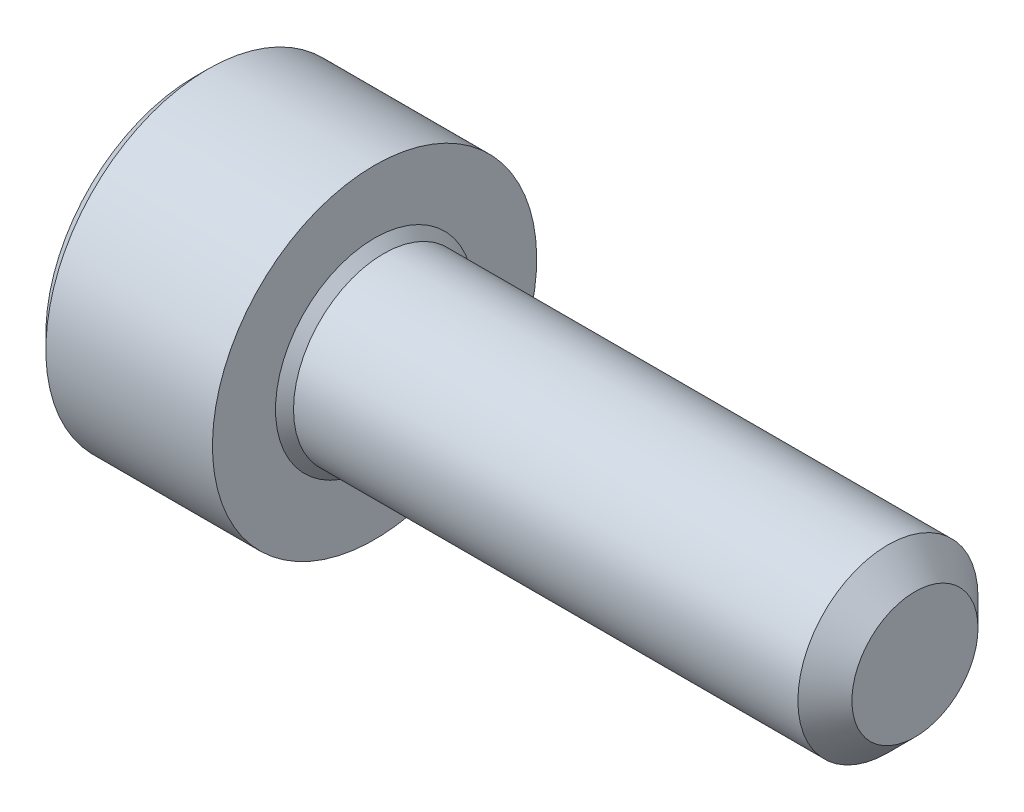
ISO-10303-21;
HEADER;
FILE_DESCRIPTION(('STEP AP214'),'2;1');
FILE_NAME('part.step','',(''),(''),'','','');
FILE_SCHEMA(('AUTOMOTIVE_DESIGN { 1 0 10303 214 1 1 1 1 }'));
ENDSEC;
DATA;
#1=APPLICATION_CONTEXT('core data for automotive mechanical design processes');
#2=APPLICATION_PROTOCOL_DEFINITION('international standard','automotive_design',2000,#1);
#3=PRODUCT_CONTEXT('',#1,'mechanical');
#4=PRODUCT('Part','Part','',(#3));
#5=PRODUCT_RELATED_PRODUCT_CATEGORY('part','',(#4));
#6=PRODUCT_DEFINITION_FORMATION('','',#4);
#7=PRODUCT_DEFINITION_CONTEXT('part definition',#1,'design');
#8=PRODUCT_DEFINITION('design','',#6,#7);
#9=PRODUCT_DEFINITION_SHAPE('','',#8);
#10=(LENGTH_UNIT() NAMED_UNIT(*) SI_UNIT(.MILLI.,.METRE.));
#11=(NAMED_UNIT(*) PLANE_ANGLE_UNIT() SI_UNIT($,.RADIAN.));
#12=(NAMED_UNIT(*) SI_UNIT($,.STERADIAN.) SOLID_ANGLE_UNIT());
#13=UNCERTAINTY_MEASURE_WITH_UNIT(LENGTH_MEASURE(1.E-05),#10,'distance_accuracy_value','');
#14=(GEOMETRIC_REPRESENTATION_CONTEXT(3) GLOBAL_UNCERTAINTY_ASSIGNED_CONTEXT((#13)) GLOBAL_UNIT_ASSIGNED_CONTEXT((#10,
#11,#12)) REPRESENTATION_CONTEXT('',''));
#15=CARTESIAN_POINT('',(0.,0.,0.));
#16=DIRECTION('',(0.,0.,1.));
#17=DIRECTION('',(1.,0.,0.));
#18=AXIS2_PLACEMENT_3D('',#15,#16,#17);
#19=CARTESIAN_POINT('',(-6.,0.,0.));
#20=DIRECTION('',(1.,0.,0.));
#21=DIRECTION('',(0.,0.,-1.));
#22=AXIS2_PLACEMENT_3D('',#19,#20,#21);
#23=CYLINDRICAL_SURFACE('',#22,1.);
#24=CARTESIAN_POINT('',(-5.9,0.,0.));
#25=DIRECTION('',(1.,0.,0.));
#26=DIRECTION('',(0.,0.,-1.));
#27=AXIS2_PLACEMENT_3D('',#24,#25,#26);
#28=CIRCLE('',#27,1.);
#29=CARTESIAN_POINT('',(-5.9,0.,-1.));
#30=VERTEX_POINT('',#29);
#31=EDGE_CURVE('E11',#30,#30,#28,.T.);
#32=ORIENTED_EDGE('',*,*,#31,.T.);
#33=EDGE_LOOP('',(#32));
#34=FACE_BOUND('',#33,.T.);
#35=CARTESIAN_POINT('',(-0.299999999999999,0.,0.));
#36=DIRECTION('',(1.,0.,0.));
#37=DIRECTION('',(0.,0.,-1.));
#38=AXIS2_PLACEMENT_3D('',#35,#36,#37);
#39=CIRCLE('',#38,1.);
#40=CARTESIAN_POINT('',(-0.299999999999999,0.,-1.));
#41=VERTEX_POINT('',#40);
#42=EDGE_CURVE('E104',#41,#41,#39,.F.);
#43=ORIENTED_EDGE('',*,*,#42,.T.);
#44=EDGE_LOOP('',(#43));
#45=FACE_BOUND('',#44,.T.);
#46=ADVANCED_FACE('F43',(#34,#45),#23,.T.);
#47=CARTESIAN_POINT('',(0.,0.,0.));
#48=DIRECTION('',(1.,0.,0.));
#49=DIRECTION('',(0.,0.,-1.));
#50=AXIS2_PLACEMENT_3D('',#47,#48,#49);
#51=PLANE('',#50);
#52=CARTESIAN_POINT('',(0.,0.,0.));
#53=DIRECTION('',(1.,0.,0.));
#54=DIRECTION('',(0.,0.,-1.));
#55=AXIS2_PLACEMENT_3D('',#52,#53,#54);
#56=CIRCLE('',#55,0.700000000000002);
#57=CARTESIAN_POINT('',(0.,0.,-0.700000000000002));
#58=VERTEX_POINT('',#57);
#59=EDGE_CURVE('E130',#58,#58,#56,.T.);
#60=ORIENTED_EDGE('',*,*,#59,.T.);
#61=EDGE_LOOP('',(#60));
#62=FACE_BOUND('',#61,.T.);
#63=ADVANCED_FACE('F206',(#62),#51,.T.);
#64=CARTESIAN_POINT('',(0.,0.,0.));
#65=DIRECTION('',(-1.,0.,0.));
#66=DIRECTION('',(0.,0.,1.));
#67=AXIS2_PLACEMENT_3D('',#64,#65,#66);
#68=CONICAL_SURFACE('',#67,0.700000000000002,0.785398163397447);
#69=ORIENTED_EDGE('',*,*,#42,.F.);
#70=EDGE_LOOP('',(#69));
#71=FACE_BOUND('',#70,.T.);
#72=ORIENTED_EDGE('',*,*,#59,.F.);
#73=EDGE_LOOP('',(#72));
#74=FACE_BOUND('',#73,.T.);
#75=ADVANCED_FACE('F214',(#71,#74),#68,.T.);
#76=CARTESIAN_POINT('',(-8.,0.,0.));
#77=DIRECTION('',(-1.,0.,0.));
#78=DIRECTION('',(0.,-1.,0.));
#79=AXIS2_PLACEMENT_3D('',#76,#77,#78);
#80=PLANE('',#79);
#81=CARTESIAN_POINT('',(-8.,0.,0.));
#82=DIRECTION('',(-1.,0.,0.));
#83=DIRECTION('',(0.,-1.,0.));
#84=AXIS2_PLACEMENT_3D('',#81,#82,#83);
#85=CIRCLE('',#84,1.65);
#86=CARTESIAN_POINT('',(-8.,-1.65,0.));
#87=VERTEX_POINT('',#86);
#88=EDGE_CURVE('E237',#87,#87,#85,.T.);
#89=ORIENTED_EDGE('',*,*,#88,.T.);
#90=EDGE_LOOP('',(#89));
#91=FACE_BOUND('',#90,.T.);
#92=CARTESIAN_POINT('',(-8.,0.,0.));
#93=DIRECTION('',(-1.,0.,0.));
#94=DIRECTION('',(0.,-1.,0.));
#95=AXIS2_PLACEMENT_3D('',#92,#93,#94);
#96=CIRCLE('',#95,0.94489291724392);
#97=CARTESIAN_POINT('',(-8.,-0.944892917243885,0.));
#98=VERTEX_POINT('',#97);
#99=EDGE_CURVE('E261',#98,#98,#96,.T.);
#100=ORIENTED_EDGE('',*,*,#99,.F.);
#101=EDGE_LOOP('',(#100));
#102=FACE_BOUND('',#101,.T.);
#103=ADVANCED_FACE('F221',(#91,#102),#80,.T.);
#104=CARTESIAN_POINT('',(-6.,0.,0.));
#105=DIRECTION('',(1.,0.,0.));
#106=DIRECTION('',(0.,1.,0.));
#107=AXIS2_PLACEMENT_3D('',#104,#105,#106);
#108=CYLINDRICAL_SURFACE('',#107,1.8);
#109=CARTESIAN_POINT('',(-7.85,0.,0.));
#110=DIRECTION('',(-1.,0.,0.));
#111=DIRECTION('',(0.,-1.,0.));
#112=AXIS2_PLACEMENT_3D('',#109,#110,#111);
#113=CIRCLE('',#112,1.8);
#114=CARTESIAN_POINT('',(-7.85,-1.8,0.));
#115=VERTEX_POINT('',#114);
#116=EDGE_CURVE('E103',#115,#115,#113,.F.);
#117=ORIENTED_EDGE('',*,*,#116,.T.);
#118=EDGE_LOOP('',(#117));
#119=FACE_BOUND('',#118,.T.);
#120=CARTESIAN_POINT('',(-6.,0.,0.));
#121=DIRECTION('',(1.,0.,0.));
#122=DIRECTION('',(0.,1.,0.));
#123=AXIS2_PLACEMENT_3D('',#120,#121,#122);
#124=CIRCLE('',#123,1.8);
#125=CARTESIAN_POINT('',(-6.,1.8,0.));
#126=VERTEX_POINT('',#125);
#127=EDGE_CURVE('E127',#126,#126,#124,.T.);
#128=ORIENTED_EDGE('',*,*,#127,.F.);
#129=EDGE_LOOP('',(#128));
#130=FACE_BOUND('',#129,.T.);
#131=ADVANCED_FACE('F247',(#119,#130),#108,.T.);
#132=CARTESIAN_POINT('',(-6.,1.8,0.));
#133=DIRECTION('',(1.,0.,0.));
#134=DIRECTION('',(0.,1.,0.));
#135=AXIS2_PLACEMENT_3D('',#132,#133,#134);
#136=PLANE('',#135);
#137=CARTESIAN_POINT('',(-6.,0.,0.));
#138=DIRECTION('',(1.,0.,0.));
#139=DIRECTION('',(0.,1.,0.));
#140=AXIS2_PLACEMENT_3D('',#137,#138,#139);
#141=CIRCLE('',#140,1.1);
#142=CARTESIAN_POINT('',(-6.,1.09999999999999,0.));
#143=VERTEX_POINT('',#142);
#144=EDGE_CURVE('E52',#143,#143,#141,.F.);
#145=ORIENTED_EDGE('',*,*,#144,.T.);
#146=EDGE_LOOP('',(#145));
#147=FACE_BOUND('',#146,.T.);
#148=ORIENTED_EDGE('',*,*,#127,.T.);
#149=EDGE_LOOP('',(#148));
#150=FACE_BOUND('',#149,.T.);
#151=ADVANCED_FACE('F149',(#147,#150),#136,.T.);
#152=CARTESIAN_POINT('',(-8.,0.,0.));
#153=DIRECTION('',(-1.,0.,0.));
#154=DIRECTION('',(0.,-1.,0.));
#155=AXIS2_PLACEMENT_3D('',#152,#153,#154);
#156=CONICAL_SURFACE('',#155,0.94489291724392,0.78539816339745);
#157=ORIENTED_EDGE('',*,*,#99,.T.);
#158=EDGE_LOOP('',(#157));
#159=FACE_BOUND('',#158,.T.);
#160=CARTESIAN_POINT('',(-8.26354974039992,-0.927204754524715,0.775));
#161=CARTESIAN_POINT('',(-8.24634486401738,-0.904777975752779,0.775));
#162=CARTESIAN_POINT('',(-8.22929831168323,-0.882230114148035,0.775));
#163=CARTESIAN_POINT('',(-8.19558827038096,-0.836841843883632,0.775));
#164=CARTESIAN_POINT('',(-8.17892487310383,-0.814001367194664,0.775));
#165=CARTESIAN_POINT('',(-8.12937102270304,-0.744631159718387,0.775));
#166=CARTESIAN_POINT('',(-8.09718110250126,-0.697592750746357,0.775));
#167=CARTESIAN_POINT('',(-8.03365912627264,-0.598723502849447,0.775));
#168=CARTESIAN_POINT('',(-8.00250563470283,-0.546776705047538,0.775));
#169=CARTESIAN_POINT('',(-7.94529218272648,-0.440245939718994,0.775));
#170=CARTESIAN_POINT('',(-7.91921502122544,-0.385671688243526,0.775));
#171=CARTESIAN_POINT('',(-7.88730225257904,-0.304081214113382,0.775));
#172=CARTESIAN_POINT('',(-7.87820420342261,-0.278347623562091,0.775));
#173=CARTESIAN_POINT('',(-7.86207047908337,-0.226228723177377,0.775));
#174=CARTESIAN_POINT('',(-7.85503493681139,-0.199843371462295,0.775));
#175=CARTESIAN_POINT('',(-7.84352067085444,-0.147041082494426,0.775));
#176=CARTESIAN_POINT('',(-7.83899556808362,-0.120634424430745,0.774999999999999));
#177=CARTESIAN_POINT('',(-7.83259343171394,-0.0674915254114844,0.774999999999999));
#178=CARTESIAN_POINT('',(-7.83071671730321,-0.0407552451209263,0.774999999999999));
#179=CARTESIAN_POINT('',(-7.82977072356043,0.0116260643388654,0.774999999999999));
#180=CARTESIAN_POINT('',(-7.83058515801563,0.037269018138621,0.774999999999999));
#181=CARTESIAN_POINT('',(-7.834711371805,0.0883540687361846,0.774999999999999));
#182=CARTESIAN_POINT('',(-7.83802360495769,0.113796128185124,0.774999999999999));
#183=CARTESIAN_POINT('',(-7.84701525409835,0.164723246555981,0.774999999999999));
#184=CARTESIAN_POINT('',(-7.85273611842227,0.190200870291352,0.774999999999999));
#185=CARTESIAN_POINT('',(-7.8662305510142,0.240594463099574,0.774999999999999));
#186=CARTESIAN_POINT('',(-7.87400399372719,0.265510466425272,0.774999999999999));
#187=CARTESIAN_POINT('',(-7.90097129047418,0.342444366547219,0.774999999999999));
#188=CARTESIAN_POINT('',(-7.92317223068854,0.393405111865246,0.774999999999999));
#189=CARTESIAN_POINT('',(-7.97257149233519,0.492944626743404,0.774999999999999));
#190=CARTESIAN_POINT('',(-7.99978747062519,0.541514186867563,0.774999999999999));
#191=CARTESIAN_POINT('',(-8.05597724201728,0.634356138534346,0.774999999999999));
#192=CARTESIAN_POINT('',(-8.08479802911567,0.678722310690616,0.774999999999999));
#193=CARTESIAN_POINT('',(-8.12936986333355,0.744086505240503,0.774999999999999));
#194=CARTESIAN_POINT('',(-8.14438779688794,0.765593264112798,0.774999999999999));
#195=CARTESIAN_POINT('',(-8.17482557637439,0.80831191117509,0.774999999999999));
#196=CARTESIAN_POINT('',(-8.19024531101967,0.829523878569376,0.774999999999999));
#197=CARTESIAN_POINT('',(-8.2058317878365,0.850612924239037,0.774999999999999));
#198=B_SPLINE_CURVE_WITH_KNOTS('',3,(#160,#161,#162,#163,#164,#165,#166,#167,#168,#169,#170,
#171,#172,#173,#174,#175,#176,#177,#178,#179,#180,#181,#182,#183,#184,#185,#186,#187,#188,#189,
#190,#191,#192,#193,#194,#195,#196,#197),.UNSPECIFIED.,.F.,.F.,(4,2,2,2,2,2,2,2,2,2,2,2,2,2,2,2,
2,2,4),(0.,0.084796017814263,0.169612120897449,0.340535581823556,0.522113930694222,
0.703065863425845,0.784881018130013,0.866701443958871,0.946955148082403,1.0272185236891,
1.1040597913574,1.1809150234796,1.25915064843496,1.3373814888708,1.50365568537708,
1.67052688828892,1.82916391970298,1.90785462314945,1.98652375857049),.UNSPECIFIED.);
#199=CARTESIAN_POINT('',(-7.95,-0.447446458621926,0.775));
#200=VERTEX_POINT('',#199);
#201=CARTESIAN_POINT('',(-7.95,0.447446458621995,0.774999999999999));
#202=VERTEX_POINT('',#201);
#203=EDGE_CURVE('E111',#200,#202,#198,.T.);
#204=ORIENTED_EDGE('',*,*,#203,.F.);
#205=CARTESIAN_POINT('',(-7.9501154924,-0.895008387297723,-0.00020000000000007));
#206=CARTESIAN_POINT('',(-7.93473849236777,-0.879622449631003,0.026449225760848));
#207=CARTESIAN_POINT('',(-7.92026414101224,-0.863979220364261,0.0535440936452933));
#208=CARTESIAN_POINT('',(-7.89376124645221,-0.832080661935443,0.10879401753221));
#209=CARTESIAN_POINT('',(-7.88174746143241,-0.815822294751214,0.136954335543406));
#210=CARTESIAN_POINT('',(-7.86116737194666,-0.783037955739701,0.19373847640391));
#211=CARTESIAN_POINT('',(-7.85254930212462,-0.766520345935694,0.222347815804048));
#212=CARTESIAN_POINT('',(-7.83927045440371,-0.733121503344651,0.280196308085729));
#213=CARTESIAN_POINT('',(-7.83459975633251,-0.716241292069252,0.309433691657218));
#214=CARTESIAN_POINT('',(-7.8303873053044,-0.687151621183431,0.359818479606916));
#215=CARTESIAN_POINT('',(-7.82976421078366,-0.674980029014561,0.380900295652407));
#216=CARTESIAN_POINT('',(-7.83080972531125,-0.65066040233772,0.423023124677803));
#217=CARTESIAN_POINT('',(-7.83247883977824,-0.638512373616855,0.444064127634148));
#218=CARTESIAN_POINT('',(-7.84081422935027,-0.60224173539888,0.506886715850629));
#219=CARTESIAN_POINT('',(-7.85080949769893,-0.578299616100621,0.54835568291609));
#220=CARTESIAN_POINT('',(-7.87493475901695,-0.536273549072689,0.621146966250762));
#221=CARTESIAN_POINT('',(-7.88780148182317,-0.517992734030413,0.652810266707754));
#222=CARTESIAN_POINT('',(-7.91678614147921,-0.482147302852728,0.714896374726717));
#223=CARTESIAN_POINT('',(-7.93289350130647,-0.464580574641128,0.745322840511963));
#224=CARTESIAN_POINT('',(-7.9501154924,-0.447330988568088,0.775199999999999));
#225=B_SPLINE_CURVE_WITH_KNOTS('',3,(#205,#206,#207,#208,#209,#210,#211,#212,#213,#214,#215,
#216,#217,#218,#219,#220,#221,#222,#223,#224),.UNSPECIFIED.,.F.,.F.,(4,2,2,2,2,2,2,2,2,4),(0.,
0.103271519444861,0.207145394489544,0.309368094406305,0.411333127173965,0.48428068376963,
0.55724432745737,0.703213293223111,0.819336676368247,0.935087023216175),.UNSPECIFIED.);
#226=CARTESIAN_POINT('',(-7.95,-0.894892917243886,0.));
#227=VERTEX_POINT('',#226);
#228=EDGE_CURVE('E171',#227,#200,#225,.T.);
#229=ORIENTED_EDGE('',*,*,#228,.F.);
#230=CARTESIAN_POINT('',(-7.9501154924,-0.447330988568087,-0.775200000000001));
#231=CARTESIAN_POINT('',(-7.93473849236777,-0.462716926234808,-0.748550774239153));
#232=CARTESIAN_POINT('',(-7.92026414101224,-0.47836015550155,-0.721455906354708));
#233=CARTESIAN_POINT('',(-7.89376124645221,-0.510258713930368,-0.666205982467791));
#234=CARTESIAN_POINT('',(-7.88174746143241,-0.526517081114597,-0.638045664456596));
#235=CARTESIAN_POINT('',(-7.86116737194666,-0.55930142012611,-0.581261523596092));
#236=CARTESIAN_POINT('',(-7.85254930212462,-0.575819029930117,-0.552652184195954));
#237=CARTESIAN_POINT('',(-7.83927045440371,-0.60921787252116,-0.494803691914273));
#238=CARTESIAN_POINT('',(-7.83459975633251,-0.626098083796559,-0.465566308342785));
#239=CARTESIAN_POINT('',(-7.8303873053044,-0.655187754682379,-0.415181520393087));
#240=CARTESIAN_POINT('',(-7.82976421078366,-0.66735934685125,-0.394099704347596));
#241=CARTESIAN_POINT('',(-7.83080972531125,-0.691678973528091,-0.3519768753222));
#242=CARTESIAN_POINT('',(-7.83247883977824,-0.703827002248956,-0.330935872365855));
#243=CARTESIAN_POINT('',(-7.84081422935027,-0.740097640466931,-0.268113284149374));
#244=CARTESIAN_POINT('',(-7.85080949769893,-0.76403975976519,-0.226644317083913));
#245=CARTESIAN_POINT('',(-7.87493475901696,-0.806065826793121,-0.153853033749241));
#246=CARTESIAN_POINT('',(-7.88780148182317,-0.824346641835398,-0.122189733292248));
#247=CARTESIAN_POINT('',(-7.91678614147921,-0.860192073013083,-0.0601036252732837));
#248=CARTESIAN_POINT('',(-7.93289350130647,-0.877758801224684,-0.0296771594880367));
#249=CARTESIAN_POINT('',(-7.9501154924,-0.895008387297724,0.000200000000000309));
#250=B_SPLINE_CURVE_WITH_KNOTS('',3,(#230,#231,#232,#233,#234,#235,#236,#237,#238,#239,#240,
#241,#242,#243,#244,#245,#246,#247,#248,#249),.UNSPECIFIED.,.F.,.F.,(4,2,2,2,2,2,2,2,2,4),(0.,
0.10327151944486,0.207145394489543,0.309368094406305,0.411333127173963,0.484280683769628,
0.557244327457368,0.703213293223109,0.819336676368247,0.935087023216178),.UNSPECIFIED.);
#251=CARTESIAN_POINT('',(-7.95,-0.447446458621926,-0.775));
#252=VERTEX_POINT('',#251);
#253=EDGE_CURVE('E164',#252,#227,#250,.T.);
#254=ORIENTED_EDGE('',*,*,#253,.F.);
#255=CARTESIAN_POINT('',(-8.26354974039992,-0.927204754524712,-0.775));
#256=CARTESIAN_POINT('',(-8.24634486401738,-0.904777975752776,-0.775));
#257=CARTESIAN_POINT('',(-8.22929831168323,-0.882230114148032,-0.775));
#258=CARTESIAN_POINT('',(-8.19558827038096,-0.836841843883629,-0.775));
#259=CARTESIAN_POINT('',(-8.17892487310383,-0.81400136719466,-0.775));
#260=CARTESIAN_POINT('',(-8.12937102270304,-0.744631159718384,-0.775));
#261=CARTESIAN_POINT('',(-8.09718110250126,-0.697592750746355,-0.775));
#262=CARTESIAN_POINT('',(-8.03365912627264,-0.598723502849445,-0.775));
#263=CARTESIAN_POINT('',(-8.00250563470282,-0.546776705047536,-0.775));
#264=CARTESIAN_POINT('',(-7.94529218272648,-0.440245939718992,-0.775));
#265=CARTESIAN_POINT('',(-7.91921502122544,-0.385671688243525,-0.775));
#266=CARTESIAN_POINT('',(-7.88730225257904,-0.304081214113381,-0.775));
#267=CARTESIAN_POINT('',(-7.87820420342261,-0.27834762356209,-0.775));
#268=CARTESIAN_POINT('',(-7.86207047908337,-0.226228723177376,-0.775));
#269=CARTESIAN_POINT('',(-7.85503493681139,-0.199843371462295,-0.775));
#270=CARTESIAN_POINT('',(-7.84352067085444,-0.147041082494426,-0.775));
#271=CARTESIAN_POINT('',(-7.83899556808362,-0.120634424430744,-0.775));
#272=CARTESIAN_POINT('',(-7.83259343171394,-0.0674915254114837,-0.775));
#273=CARTESIAN_POINT('',(-7.83071671730321,-0.0407552451209257,-0.775));
#274=CARTESIAN_POINT('',(-7.82977072356043,0.0116260643388659,-0.775));
#275=CARTESIAN_POINT('',(-7.83058515801563,0.0372690181386215,-0.775));
#276=CARTESIAN_POINT('',(-7.834711371805,0.0883540687361849,-0.775));
#277=CARTESIAN_POINT('',(-7.8380236049577,0.113796128185124,-0.775));
#278=CARTESIAN_POINT('',(-7.84701525409835,0.164723246555982,-0.775));
#279=CARTESIAN_POINT('',(-7.85273611842227,0.190200870291353,-0.775));
#280=CARTESIAN_POINT('',(-7.8662305510142,0.240594463099574,-0.775));
#281=CARTESIAN_POINT('',(-7.87400399372719,0.265510466425272,-0.775));
#282=CARTESIAN_POINT('',(-7.90097129047418,0.342444366547219,-0.775));
#283=CARTESIAN_POINT('',(-7.92317223068854,0.393405111865246,-0.775));
#284=CARTESIAN_POINT('',(-7.97257149233519,0.492944626743404,-0.775));
#285=CARTESIAN_POINT('',(-7.99978747062519,0.541514186867563,-0.775));
#286=CARTESIAN_POINT('',(-8.05597724201728,0.634356138534346,-0.775));
#287=CARTESIAN_POINT('',(-8.08479802911567,0.678722310690616,-0.775));
#288=CARTESIAN_POINT('',(-8.12936986333355,0.744086505240503,-0.775));
#289=CARTESIAN_POINT('',(-8.14438779688794,0.765593264112798,-0.775));
#290=CARTESIAN_POINT('',(-8.17482557637439,0.80831191117509,-0.775));
#291=CARTESIAN_POINT('',(-8.19024531101968,0.829523878569377,-0.775));
#292=CARTESIAN_POINT('',(-8.2058317878365,0.850612924239038,-0.775));
#293=B_SPLINE_CURVE_WITH_KNOTS('',3,(#255,#256,#257,#258,#259,#260,#261,#262,#263,#264,#265,
#266,#267,#268,#269,#270,#271,#272,#273,#274,#275,#276,#277,#278,#279,#280,#281,#282,#283,#284,
#285,#286,#287,#288,#289,#290,#291,#292),.UNSPECIFIED.,.F.,.F.,(4,2,2,2,2,2,2,2,2,2,2,2,2,2,2,2,
2,2,4),(0.,0.0847960178142633,0.16961212089745,0.340535581823556,0.522113930694221,
0.703065863425843,0.784881018130011,0.866701443958868,0.9469551480824,1.0272185236891,
1.1040597913574,1.18091502347959,1.25915064843496,1.3373814888708,1.50365568537708,
1.67052688828891,1.82916391970298,1.90785462314944,1.98652375857048),.UNSPECIFIED.);
#294=CARTESIAN_POINT('',(-7.95,0.447446458621995,-0.775));
#295=VERTEX_POINT('',#294);
#296=EDGE_CURVE('E59',#295,#252,#293,.F.);
#297=ORIENTED_EDGE('',*,*,#296,.F.);
#298=CARTESIAN_POINT('',(-7.95011549239999,0.895008387297792,0.000199999999999911));
#299=CARTESIAN_POINT('',(-7.93473849236776,0.879622449631072,-0.026449225760848));
#300=CARTESIAN_POINT('',(-7.92026414101223,0.86397922036433,-0.0535440936452935));
#301=CARTESIAN_POINT('',(-7.8937612464522,0.832080661935512,-0.108794017532211));
#302=CARTESIAN_POINT('',(-7.8817474614324,0.815822294751282,-0.136954335543406));
#303=CARTESIAN_POINT('',(-7.86116737194666,0.783037955739769,-0.19373847640391));
#304=CARTESIAN_POINT('',(-7.85254930212461,0.766520345935762,-0.222347815804047));
#305=CARTESIAN_POINT('',(-7.8392704544037,0.733121503344719,-0.280196308085729));
#306=CARTESIAN_POINT('',(-7.8345997563325,0.71624129206932,-0.309433691657217));
#307=CARTESIAN_POINT('',(-7.83038730530439,0.6871516211835,-0.359818479606915));
#308=CARTESIAN_POINT('',(-7.82976421078366,0.67498002901463,-0.380900295652406));
#309=CARTESIAN_POINT('',(-7.83080972531124,0.650660402337789,-0.423023124677802));
#310=CARTESIAN_POINT('',(-7.83247883977823,0.638512373616923,-0.444064127634147));
#311=CARTESIAN_POINT('',(-7.84081422935026,0.602241735398949,-0.506886715850628));
#312=CARTESIAN_POINT('',(-7.85080949769893,0.57829961610069,-0.548355682916088));
#313=CARTESIAN_POINT('',(-7.87493475901695,0.536273549072758,-0.621146966250761));
#314=CARTESIAN_POINT('',(-7.88780148182316,0.517992734030482,-0.652810266707754));
#315=CARTESIAN_POINT('',(-7.9167861414792,0.482147302852796,-0.714896374726718));
#316=CARTESIAN_POINT('',(-7.93289350130647,0.464580574641195,-0.745322840511965));
#317=CARTESIAN_POINT('',(-7.9501154924,0.447330988568156,-0.775200000000001));
#318=B_SPLINE_CURVE_WITH_KNOTS('',3,(#298,#299,#300,#301,#302,#303,#304,#305,#306,#307,#308,
#309,#310,#311,#312,#313,#314,#315,#316,#317),.UNSPECIFIED.,.F.,.F.,(4,2,2,2,2,2,2,2,2,4),(0.,
0.103271519444861,0.207145394489544,0.309368094406305,0.411333127173964,0.484280683769628,
0.557244327457369,0.703213293223109,0.819336676368247,0.935087023216176),.UNSPECIFIED.);
#319=CARTESIAN_POINT('',(-7.95,0.894892917243954,0.));
#320=VERTEX_POINT('',#319);
#321=EDGE_CURVE('E96',#320,#295,#318,.T.);
#322=ORIENTED_EDGE('',*,*,#321,.F.);
#323=CARTESIAN_POINT('',(-7.95011549239999,0.447330988568157,0.775199999999999));
#324=CARTESIAN_POINT('',(-7.93473849236776,0.462716926234878,0.748550774239151));
#325=CARTESIAN_POINT('',(-7.92026414101223,0.478360155501619,0.721455906354706));
#326=CARTESIAN_POINT('',(-7.8937612464522,0.510258713930437,0.666205982467789));
#327=CARTESIAN_POINT('',(-7.8817474614324,0.526517081114666,0.638045664456594));
#328=CARTESIAN_POINT('',(-7.86116737194666,0.559301420126179,0.58126152359609));
#329=CARTESIAN_POINT('',(-7.85254930212461,0.575819029930186,0.552652184195953));
#330=CARTESIAN_POINT('',(-7.8392704544037,0.609217872521229,0.494803691914271));
#331=CARTESIAN_POINT('',(-7.8345997563325,0.626098083796628,0.465566308342783));
#332=CARTESIAN_POINT('',(-7.83038730530439,0.655187754682448,0.415181520393085));
#333=CARTESIAN_POINT('',(-7.82976421078366,0.667359346851319,0.394099704347594));
#334=CARTESIAN_POINT('',(-7.83080972531124,0.69167897352816,0.351976875322198));
#335=CARTESIAN_POINT('',(-7.83247883977823,0.703827002249025,0.330935872365853));
#336=CARTESIAN_POINT('',(-7.84081422935026,0.740097640467,0.268113284149372));
#337=CARTESIAN_POINT('',(-7.85080949769893,0.764039759765259,0.226644317083911));
#338=CARTESIAN_POINT('',(-7.87493475901695,0.806065826793191,0.153853033749239));
#339=CARTESIAN_POINT('',(-7.88780148182316,0.824346641835467,0.122189733292247));
#340=CARTESIAN_POINT('',(-7.9167861414792,0.860192073013152,0.0601036252732833));
#341=CARTESIAN_POINT('',(-7.93289350130646,0.877758801224753,0.029677159488037));
#342=CARTESIAN_POINT('',(-7.95011549239999,0.895008387297792,-0.000199999999999158));
#343=B_SPLINE_CURVE_WITH_KNOTS('',3,(#323,#324,#325,#326,#327,#328,#329,#330,#331,#332,#333,
#334,#335,#336,#337,#338,#339,#340,#341,#342),.UNSPECIFIED.,.F.,.F.,(4,2,2,2,2,2,2,2,2,4),(0.,
0.103271519444861,0.207145394489543,0.309368094406304,0.411333127173964,0.484280683769628,
0.557244327457369,0.703213293223109,0.819336676368246,0.935087023216174),.UNSPECIFIED.);
#344=EDGE_CURVE('E99',#202,#320,#343,.T.);
#345=ORIENTED_EDGE('',*,*,#344,.F.);
#346=EDGE_LOOP('',(#204,#229,#254,#297,#322,#345));
#347=FACE_BOUND('',#346,.T.);
#348=ADVANCED_FACE('F98',(#159,#347),#156,.F.);
#349=CARTESIAN_POINT('',(-7.,0.,0.));
#350=DIRECTION('',(-1.,0.,0.));
#351=DIRECTION('',(0.,-1.,0.));
#352=AXIS2_PLACEMENT_3D('',#349,#350,#351);
#353=PLANE('',#352);
#354=DIRECTION('',(0.,0.5,-0.866025403784438));
#355=VECTOR('',#354,1.);
#356=CARTESIAN_POINT('',(-7.,0.447446458621991,0.774999999999999));
#357=LINE('',#356,#355);
#358=CARTESIAN_POINT('',(-7.,0.447446458621991,0.774999999999999));
#359=VERTEX_POINT('',#358);
#360=CARTESIAN_POINT('',(-7.,0.894892917243951,0.));
#361=VERTEX_POINT('',#360);
#362=EDGE_CURVE('E110',#359,#361,#357,.T.);
#363=ORIENTED_EDGE('',*,*,#362,.T.);
#364=DIRECTION('',(0.,-0.5,-0.866025403784439));
#365=VECTOR('',#364,1.);
#366=CARTESIAN_POINT('',(-7.,0.894892917243951,0.));
#367=LINE('',#366,#365);
#368=CARTESIAN_POINT('',(-7.,0.447446458621991,-0.775));
#369=VERTEX_POINT('',#368);
#370=EDGE_CURVE('E115',#361,#369,#367,.T.);
#371=ORIENTED_EDGE('',*,*,#370,.T.);
#372=DIRECTION('',(0.,-1.,0.));
#373=VECTOR('',#372,1.);
#374=CARTESIAN_POINT('',(-7.,0.447446458621991,-0.775));
#375=LINE('',#374,#373);
#376=CARTESIAN_POINT('',(-7.,-0.447446458621929,-0.775));
#377=VERTEX_POINT('',#376);
#378=EDGE_CURVE('E279',#369,#377,#375,.T.);
#379=ORIENTED_EDGE('',*,*,#378,.T.);
#380=DIRECTION('',(0.,-0.5,0.866025403784438));
#381=VECTOR('',#380,1.);
#382=CARTESIAN_POINT('',(-7.,-0.447446458621929,-0.775));
#383=LINE('',#382,#381);
#384=CARTESIAN_POINT('',(-7.,-0.894892917243889,0.));
#385=VERTEX_POINT('',#384);
#386=EDGE_CURVE('E276',#377,#385,#383,.T.);
#387=ORIENTED_EDGE('',*,*,#386,.T.);
#388=DIRECTION('',(0.,0.5,0.866025403784439));
#389=VECTOR('',#388,1.);
#390=CARTESIAN_POINT('',(-7.,-0.894892917243889,0.));
#391=LINE('',#390,#389);
#392=CARTESIAN_POINT('',(-7.,-0.44744645862193,0.775));
#393=VERTEX_POINT('',#392);
#394=EDGE_CURVE('E123',#385,#393,#391,.T.);
#395=ORIENTED_EDGE('',*,*,#394,.T.);
#396=DIRECTION('',(0.,1.,0.));
#397=VECTOR('',#396,1.);
#398=CARTESIAN_POINT('',(-7.,-0.44744645862193,0.775));
#399=LINE('',#398,#397);
#400=EDGE_CURVE('E118',#393,#359,#399,.T.);
#401=ORIENTED_EDGE('',*,*,#400,.T.);
#402=EDGE_LOOP('',(#363,#371,#379,#387,#395,#401));
#403=FACE_BOUND('',#402,.T.);
#404=ADVANCED_FACE('F148',(#403),#353,.T.);
#405=CARTESIAN_POINT('',(-7.,0.894892917243951,0.));
#406=DIRECTION('',(0.,0.866025403784439,-0.5));
#407=DIRECTION('',(0.,0.5,0.866025403784439));
#408=AXIS2_PLACEMENT_3D('',#405,#406,#407);
#409=PLANE('',#408);
#410=DIRECTION('',(-1.,0.,0.));
#411=VECTOR('',#410,1.);
#412=CARTESIAN_POINT('',(-7.,0.894892917243951,0.));
#413=LINE('',#412,#411);
#414=EDGE_CURVE('E108',#361,#320,#413,.T.);
#415=ORIENTED_EDGE('',*,*,#414,.T.);
#416=ORIENTED_EDGE('',*,*,#321,.T.);
#417=DIRECTION('',(-1.,0.,0.));
#418=VECTOR('',#417,1.);
#419=CARTESIAN_POINT('',(-7.,0.447446458621991,-0.775));
#420=LINE('',#419,#418);
#421=EDGE_CURVE('E117',#369,#295,#420,.T.);
#422=ORIENTED_EDGE('',*,*,#421,.F.);
#423=ORIENTED_EDGE('',*,*,#370,.F.);
#424=EDGE_LOOP('',(#415,#416,#422,#423));
#425=FACE_BOUND('',#424,.T.);
#426=ADVANCED_FACE('F113',(#425),#409,.F.);
#427=CARTESIAN_POINT('',(-7.,0.447446458621991,-0.775));
#428=DIRECTION('',(0.,0.,-1.));
#429=DIRECTION('',(0.,1.,0.));
#430=AXIS2_PLACEMENT_3D('',#427,#428,#429);
#431=PLANE('',#430);
#432=ORIENTED_EDGE('',*,*,#421,.T.);
#433=ORIENTED_EDGE('',*,*,#296,.T.);
#434=DIRECTION('',(-1.,0.,0.));
#435=VECTOR('',#434,1.);
#436=CARTESIAN_POINT('',(-7.,-0.447446458621929,-0.775));
#437=LINE('',#436,#435);
#438=EDGE_CURVE('E120',#377,#252,#437,.T.);
#439=ORIENTED_EDGE('',*,*,#438,.F.);
#440=ORIENTED_EDGE('',*,*,#378,.F.);
#441=EDGE_LOOP('',(#432,#433,#439,#440));
#442=FACE_BOUND('',#441,.T.);
#443=ADVANCED_FACE('F197',(#442),#431,.F.);
#444=CARTESIAN_POINT('',(-7.,-0.447446458621929,-0.775));
#445=DIRECTION('',(0.,-0.866025403784439,-0.5));
#446=DIRECTION('',(0.,0.5,-0.866025403784438));
#447=AXIS2_PLACEMENT_3D('',#444,#445,#446);
#448=PLANE('',#447);
#449=ORIENTED_EDGE('',*,*,#438,.T.);
#450=ORIENTED_EDGE('',*,*,#253,.T.);
#451=DIRECTION('',(-1.,0.,0.));
#452=VECTOR('',#451,1.);
#453=CARTESIAN_POINT('',(-7.,-0.894892917243889,0.));
#454=LINE('',#453,#452);
#455=EDGE_CURVE('E270',#385,#227,#454,.T.);
#456=ORIENTED_EDGE('',*,*,#455,.F.);
#457=ORIENTED_EDGE('',*,*,#386,.F.);
#458=EDGE_LOOP('',(#449,#450,#456,#457));
#459=FACE_BOUND('',#458,.T.);
#460=ADVANCED_FACE('F193',(#459),#448,.F.);
#461=CARTESIAN_POINT('',(-7.,-0.894892917243889,0.));
#462=DIRECTION('',(0.,-0.866025403784439,0.5));
#463=DIRECTION('',(0.,-0.5,-0.866025403784439));
#464=AXIS2_PLACEMENT_3D('',#461,#462,#463);
#465=PLANE('',#464);
#466=ORIENTED_EDGE('',*,*,#455,.T.);
#467=ORIENTED_EDGE('',*,*,#228,.T.);
#468=DIRECTION('',(-1.,0.,0.));
#469=VECTOR('',#468,1.);
#470=CARTESIAN_POINT('',(-7.,-0.44744645862193,0.775));
#471=LINE('',#470,#469);
#472=EDGE_CURVE('E268',#393,#200,#471,.T.);
#473=ORIENTED_EDGE('',*,*,#472,.F.);
#474=ORIENTED_EDGE('',*,*,#394,.F.);
#475=EDGE_LOOP('',(#466,#467,#473,#474));
#476=FACE_BOUND('',#475,.T.);
#477=ADVANCED_FACE('F190',(#476),#465,.F.);
#478=CARTESIAN_POINT('',(-7.,-0.44744645862193,0.775));
#479=DIRECTION('',(0.,0.,1.));
#480=DIRECTION('',(0.,-1.,0.));
#481=AXIS2_PLACEMENT_3D('',#478,#479,#480);
#482=PLANE('',#481);
#483=ORIENTED_EDGE('',*,*,#472,.T.);
#484=ORIENTED_EDGE('',*,*,#203,.T.);
#485=DIRECTION('',(-1.,0.,0.));
#486=VECTOR('',#485,1.);
#487=CARTESIAN_POINT('',(-7.,0.447446458621991,0.774999999999999));
#488=LINE('',#487,#486);
#489=EDGE_CURVE('E67',#359,#202,#488,.T.);
#490=ORIENTED_EDGE('',*,*,#489,.F.);
#491=ORIENTED_EDGE('',*,*,#400,.F.);
#492=EDGE_LOOP('',(#483,#484,#490,#491));
#493=FACE_BOUND('',#492,.T.);
#494=ADVANCED_FACE('F187',(#493),#482,.F.);
#495=CARTESIAN_POINT('',(-7.,0.447446458621991,0.774999999999999));
#496=DIRECTION('',(0.,0.866025403784438,0.5));
#497=DIRECTION('',(0.,-0.5,0.866025403784439));
#498=AXIS2_PLACEMENT_3D('',#495,#496,#497);
#499=PLANE('',#498);
#500=ORIENTED_EDGE('',*,*,#489,.T.);
#501=ORIENTED_EDGE('',*,*,#344,.T.);
#502=ORIENTED_EDGE('',*,*,#414,.F.);
#503=ORIENTED_EDGE('',*,*,#362,.F.);
#504=EDGE_LOOP('',(#500,#501,#502,#503));
#505=FACE_BOUND('',#504,.T.);
#506=ADVANCED_FACE('F107',(#505),#499,.F.);
#507=CARTESIAN_POINT('',(-7.85,0.,0.));
#508=DIRECTION('',(1.,0.,0.));
#509=DIRECTION('',(0.,1.,0.));
#510=AXIS2_PLACEMENT_3D('',#507,#508,#509);
#511=CONICAL_SURFACE('',#510,1.8,0.785398163397454);
#512=ORIENTED_EDGE('',*,*,#88,.F.);
#513=EDGE_LOOP('',(#512));
#514=FACE_BOUND('',#513,.T.);
#515=ORIENTED_EDGE('',*,*,#116,.F.);
#516=EDGE_LOOP('',(#515));
#517=FACE_BOUND('',#516,.T.);
#518=ADVANCED_FACE('F224',(#514,#517),#511,.T.);
#519=CARTESIAN_POINT('',(-6.,0.,0.));
#520=DIRECTION('',(-1.,0.,0.));
#521=DIRECTION('',(0.,0.,1.));
#522=AXIS2_PLACEMENT_3D('',#519,#520,#521);
#523=CONICAL_SURFACE('',#522,1.1,0.785398163397442);
#524=ORIENTED_EDGE('',*,*,#31,.F.);
#525=EDGE_LOOP('',(#524));
#526=FACE_BOUND('',#525,.T.);
#527=ORIENTED_EDGE('',*,*,#144,.F.);
#528=EDGE_LOOP('',(#527));
#529=FACE_BOUND('',#528,.T.);
#530=ADVANCED_FACE('F46',(#526,#529),#523,.T.);
#531=CLOSED_SHELL('',(#46,#63,#75,#103,#131,#151,#348,#404,#426,#443,#460,#477,#494,#506,#518,#530));
#532=MANIFOLD_SOLID_BREP('B2',#531);
#533=ADVANCED_BREP_SHAPE_REPRESENTATION('',(#18,#532),#14);
#534=SHAPE_DEFINITION_REPRESENTATION(#9,#533);
ENDSEC;
END-ISO-10303-21;
